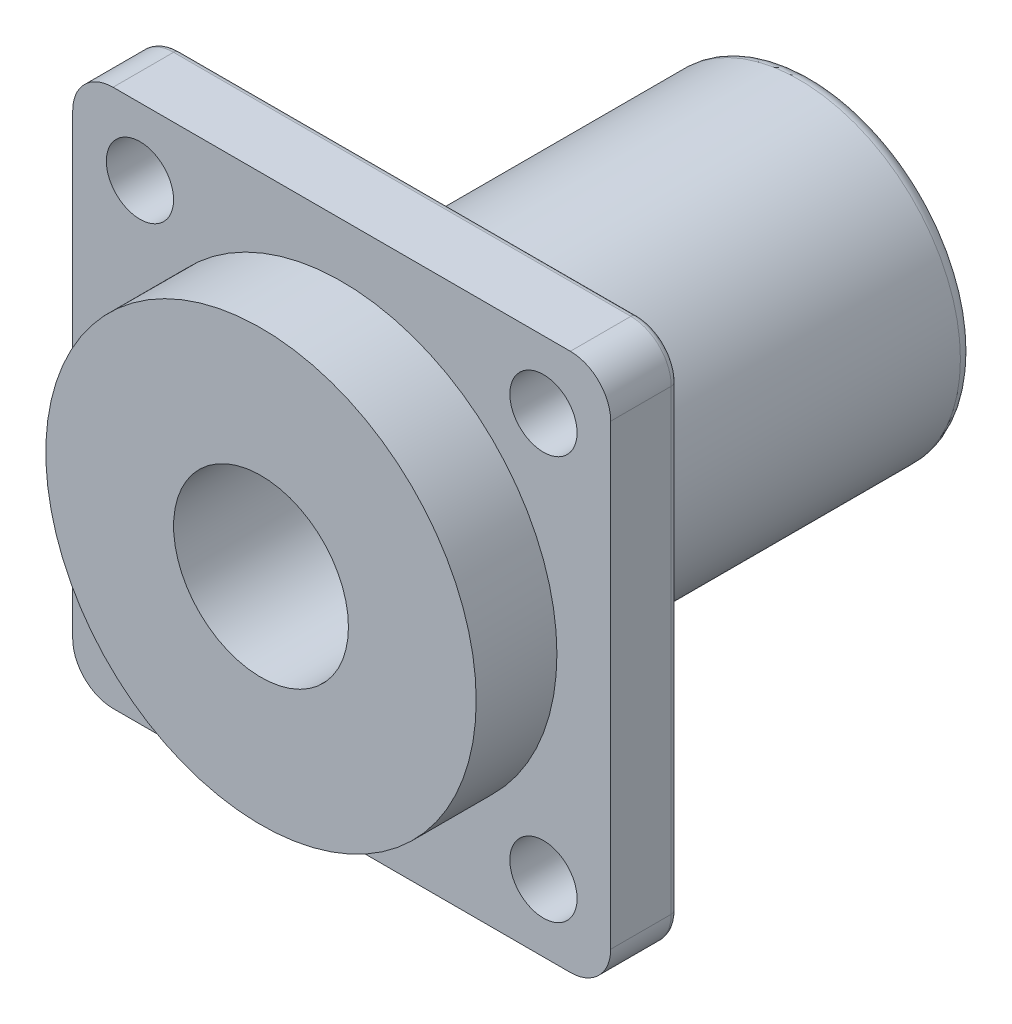
ISO-10303-21;
HEADER;
FILE_DESCRIPTION(('STEP AP214'),'2;1');
FILE_NAME('part.step','',(''),(''),'','','');
FILE_SCHEMA(('AUTOMOTIVE_DESIGN { 1 0 10303 214 1 1 1 1 }'));
ENDSEC;
DATA;
#1=APPLICATION_CONTEXT('core data for automotive mechanical design processes');
#2=APPLICATION_PROTOCOL_DEFINITION('international standard','automotive_design',2000,#1);
#3=PRODUCT_CONTEXT('',#1,'mechanical');
#4=PRODUCT('Part','Part','',(#3));
#5=PRODUCT_RELATED_PRODUCT_CATEGORY('part','',(#4));
#6=PRODUCT_DEFINITION_FORMATION('','',#4);
#7=PRODUCT_DEFINITION_CONTEXT('part definition',#1,'design');
#8=PRODUCT_DEFINITION('design','',#6,#7);
#9=PRODUCT_DEFINITION_SHAPE('','',#8);
#10=(LENGTH_UNIT() NAMED_UNIT(*) SI_UNIT(.MILLI.,.METRE.));
#11=(NAMED_UNIT(*) PLANE_ANGLE_UNIT() SI_UNIT($,.RADIAN.));
#12=(NAMED_UNIT(*) SI_UNIT($,.STERADIAN.) SOLID_ANGLE_UNIT());
#13=UNCERTAINTY_MEASURE_WITH_UNIT(LENGTH_MEASURE(1.E-05),#10,'distance_accuracy_value','');
#14=(GEOMETRIC_REPRESENTATION_CONTEXT(3) GLOBAL_UNCERTAINTY_ASSIGNED_CONTEXT((#13)) GLOBAL_UNIT_ASSIGNED_CONTEXT((#10,
#11,#12)) REPRESENTATION_CONTEXT('',''));
#15=CARTESIAN_POINT('',(0.,0.,0.));
#16=DIRECTION('',(0.,0.,1.));
#17=DIRECTION('',(1.,0.,0.));
#18=AXIS2_PLACEMENT_3D('',#15,#16,#17);
#19=CARTESIAN_POINT('',(0.,0.,2.5));
#20=DIRECTION('',(0.,0.,1.));
#21=DIRECTION('',(1.,0.,0.));
#22=AXIS2_PLACEMENT_3D('',#19,#20,#21);
#23=PLANE('',#22);
#24=DIRECTION('',(0.,-1.,0.));
#25=VECTOR('',#24,1.);
#26=CARTESIAN_POINT('',(20.,0.,2.5));
#27=LINE('',#26,#25);
#28=CARTESIAN_POINT('',(20.,17.,2.5));
#29=VERTEX_POINT('',#28);
#30=CARTESIAN_POINT('',(20.,-17.,2.5));
#31=VERTEX_POINT('',#30);
#32=EDGE_CURVE('E169',#29,#31,#27,.T.);
#33=ORIENTED_EDGE('',*,*,#32,.F.);
#34=CARTESIAN_POINT('',(17.,17.,2.5));
#35=DIRECTION('',(0.,0.,1.));
#36=DIRECTION('',(1.,0.,0.));
#37=AXIS2_PLACEMENT_3D('',#34,#35,#36);
#38=CIRCLE('',#37,3.);
#39=CARTESIAN_POINT('',(17.,20.,2.5));
#40=VERTEX_POINT('',#39);
#41=EDGE_CURVE('E167',#29,#40,#38,.T.);
#42=ORIENTED_EDGE('',*,*,#41,.T.);
#43=DIRECTION('',(1.,0.,0.));
#44=VECTOR('',#43,1.);
#45=CARTESIAN_POINT('',(0.,20.,2.5));
#46=LINE('',#45,#44);
#47=CARTESIAN_POINT('',(-17.,20.,2.5));
#48=VERTEX_POINT('',#47);
#49=EDGE_CURVE('E149',#48,#40,#46,.T.);
#50=ORIENTED_EDGE('',*,*,#49,.F.);
#51=CARTESIAN_POINT('',(-17.,17.,2.5));
#52=DIRECTION('',(0.,0.,1.));
#53=DIRECTION('',(1.,0.,0.));
#54=AXIS2_PLACEMENT_3D('',#51,#52,#53);
#55=CIRCLE('',#54,3.);
#56=CARTESIAN_POINT('',(-20.,17.,2.5));
#57=VERTEX_POINT('',#56);
#58=EDGE_CURVE('E164',#48,#57,#55,.T.);
#59=ORIENTED_EDGE('',*,*,#58,.T.);
#60=DIRECTION('',(0.,-1.,0.));
#61=VECTOR('',#60,1.);
#62=CARTESIAN_POINT('',(-20.,0.,2.5));
#63=LINE('',#62,#61);
#64=CARTESIAN_POINT('',(-20.,-17.,2.5));
#65=VERTEX_POINT('',#64);
#66=EDGE_CURVE('E168',#57,#65,#63,.T.);
#67=ORIENTED_EDGE('',*,*,#66,.T.);
#68=CARTESIAN_POINT('',(-17.,-17.,2.5));
#69=DIRECTION('',(0.,0.,1.));
#70=DIRECTION('',(1.,0.,0.));
#71=AXIS2_PLACEMENT_3D('',#68,#69,#70);
#72=CIRCLE('',#71,3.);
#73=CARTESIAN_POINT('',(-17.,-20.,2.5));
#74=VERTEX_POINT('',#73);
#75=EDGE_CURVE('E174',#65,#74,#72,.T.);
#76=ORIENTED_EDGE('',*,*,#75,.T.);
#77=DIRECTION('',(1.,0.,0.));
#78=VECTOR('',#77,1.);
#79=CARTESIAN_POINT('',(0.,-20.,2.5));
#80=LINE('',#79,#78);
#81=CARTESIAN_POINT('',(17.,-20.,2.5));
#82=VERTEX_POINT('',#81);
#83=EDGE_CURVE('E158',#74,#82,#80,.T.);
#84=ORIENTED_EDGE('',*,*,#83,.T.);
#85=CARTESIAN_POINT('',(17.,-17.,2.5));
#86=DIRECTION('',(0.,0.,1.));
#87=DIRECTION('',(1.,0.,0.));
#88=AXIS2_PLACEMENT_3D('',#85,#86,#87);
#89=CIRCLE('',#88,3.);
#90=EDGE_CURVE('E177',#82,#31,#89,.T.);
#91=ORIENTED_EDGE('',*,*,#90,.T.);
#92=EDGE_LOOP('',(#33,#42,#50,#59,#67,#76,#84,#91));
#93=FACE_BOUND('',#92,.T.);
#94=CARTESIAN_POINT('',(-15.,15.,2.5));
#95=DIRECTION('',(0.,0.,1.));
#96=DIRECTION('',(1.,0.,0.));
#97=AXIS2_PLACEMENT_3D('',#94,#95,#96);
#98=CIRCLE('',#97,2.5);
#99=CARTESIAN_POINT('',(-12.5,15.,2.5));
#100=VERTEX_POINT('',#99);
#101=EDGE_CURVE('E390',#100,#100,#98,.T.);
#102=ORIENTED_EDGE('',*,*,#101,.F.);
#103=EDGE_LOOP('',(#102));
#104=FACE_BOUND('',#103,.T.);
#105=CARTESIAN_POINT('',(15.,15.,2.5));
#106=DIRECTION('',(0.,0.,1.));
#107=DIRECTION('',(1.,0.,0.));
#108=AXIS2_PLACEMENT_3D('',#105,#106,#107);
#109=CIRCLE('',#108,2.5);
#110=CARTESIAN_POINT('',(17.5,15.,2.5));
#111=VERTEX_POINT('',#110);
#112=EDGE_CURVE('E393',#111,#111,#109,.T.);
#113=ORIENTED_EDGE('',*,*,#112,.F.);
#114=EDGE_LOOP('',(#113));
#115=FACE_BOUND('',#114,.T.);
#116=CARTESIAN_POINT('',(15.,-15.,2.5));
#117=DIRECTION('',(0.,0.,1.));
#118=DIRECTION('',(1.,0.,0.));
#119=AXIS2_PLACEMENT_3D('',#116,#117,#118);
#120=CIRCLE('',#119,2.5);
#121=CARTESIAN_POINT('',(17.5,-15.,2.5));
#122=VERTEX_POINT('',#121);
#123=EDGE_CURVE('E396',#122,#122,#120,.T.);
#124=ORIENTED_EDGE('',*,*,#123,.F.);
#125=EDGE_LOOP('',(#124));
#126=FACE_BOUND('',#125,.T.);
#127=CARTESIAN_POINT('',(-15.,-15.,2.5));
#128=DIRECTION('',(0.,0.,1.));
#129=DIRECTION('',(1.,0.,0.));
#130=AXIS2_PLACEMENT_3D('',#127,#128,#129);
#131=CIRCLE('',#130,2.5);
#132=CARTESIAN_POINT('',(-12.5,-15.,2.5));
#133=VERTEX_POINT('',#132);
#134=EDGE_CURVE('E375',#133,#133,#131,.T.);
#135=ORIENTED_EDGE('',*,*,#134,.F.);
#136=EDGE_LOOP('',(#135));
#137=FACE_BOUND('',#136,.T.);
#138=CARTESIAN_POINT('',(0.,0.,2.5));
#139=DIRECTION('',(0.,0.,1.));
#140=DIRECTION('',(1.,0.,0.));
#141=AXIS2_PLACEMENT_3D('',#138,#139,#140);
#142=CIRCLE('',#141,16.);
#143=CARTESIAN_POINT('',(16.,0.,2.5));
#144=VERTEX_POINT('',#143);
#145=EDGE_CURVE('E401',#144,#144,#142,.T.);
#146=ORIENTED_EDGE('',*,*,#145,.F.);
#147=EDGE_LOOP('',(#146));
#148=FACE_BOUND('',#147,.T.);
#149=ADVANCED_FACE('F54',(#93,#104,#115,#126,#137,#148),#23,.T.);
#150=CARTESIAN_POINT('',(20.,0.,2.5));
#151=DIRECTION('',(1.,0.,0.));
#152=DIRECTION('',(0.,0.,-1.));
#153=AXIS2_PLACEMENT_3D('',#150,#151,#152);
#154=PLANE('',#153);
#155=DIRECTION('',(0.,0.,-1.));
#156=VECTOR('',#155,1.);
#157=CARTESIAN_POINT('',(20.,-17.,-2.5));
#158=LINE('',#157,#156);
#159=CARTESIAN_POINT('',(20.,-17.,-2.));
#160=VERTEX_POINT('',#159);
#161=EDGE_CURVE('E179',#31,#160,#158,.T.);
#162=ORIENTED_EDGE('',*,*,#161,.T.);
#163=DIRECTION('',(0.,-1.,0.));
#164=VECTOR('',#163,1.);
#165=CARTESIAN_POINT('',(20.,17.,-2.));
#166=LINE('',#165,#164);
#167=CARTESIAN_POINT('',(20.,17.,-2.));
#168=VERTEX_POINT('',#167);
#169=EDGE_CURVE('E214',#160,#168,#166,.F.);
#170=ORIENTED_EDGE('',*,*,#169,.T.);
#171=DIRECTION('',(0.,0.,-1.));
#172=VECTOR('',#171,1.);
#173=CARTESIAN_POINT('',(20.,17.,2.5));
#174=LINE('',#173,#172);
#175=EDGE_CURVE('E175',#168,#29,#174,.F.);
#176=ORIENTED_EDGE('',*,*,#175,.T.);
#177=ORIENTED_EDGE('',*,*,#32,.T.);
#178=EDGE_LOOP('',(#162,#170,#176,#177));
#179=FACE_BOUND('',#178,.T.);
#180=ADVANCED_FACE('F266',(#179),#154,.T.);
#181=CARTESIAN_POINT('',(0.,20.,2.5));
#182=DIRECTION('',(0.,1.,0.));
#183=DIRECTION('',(0.,0.,1.));
#184=AXIS2_PLACEMENT_3D('',#181,#182,#183);
#185=PLANE('',#184);
#186=DIRECTION('',(0.,0.,-1.));
#187=VECTOR('',#186,1.);
#188=CARTESIAN_POINT('',(17.,20.,2.5));
#189=LINE('',#188,#187);
#190=CARTESIAN_POINT('',(17.,20.,-2.));
#191=VERTEX_POINT('',#190);
#192=EDGE_CURVE('E157',#40,#191,#189,.T.);
#193=ORIENTED_EDGE('',*,*,#192,.T.);
#194=DIRECTION('',(1.,0.,0.));
#195=VECTOR('',#194,1.);
#196=CARTESIAN_POINT('',(-17.,20.,-2.));
#197=LINE('',#196,#195);
#198=CARTESIAN_POINT('',(-17.,20.,-2.));
#199=VERTEX_POINT('',#198);
#200=EDGE_CURVE('E152',#191,#199,#197,.F.);
#201=ORIENTED_EDGE('',*,*,#200,.T.);
#202=DIRECTION('',(0.,0.,-1.));
#203=VECTOR('',#202,1.);
#204=CARTESIAN_POINT('',(-17.,20.,2.5));
#205=LINE('',#204,#203);
#206=EDGE_CURVE('E145',#199,#48,#205,.F.);
#207=ORIENTED_EDGE('',*,*,#206,.T.);
#208=ORIENTED_EDGE('',*,*,#49,.T.);
#209=EDGE_LOOP('',(#193,#201,#207,#208));
#210=FACE_BOUND('',#209,.T.);
#211=ADVANCED_FACE('F148',(#210),#185,.T.);
#212=CARTESIAN_POINT('',(-20.,0.,2.5));
#213=DIRECTION('',(1.,0.,0.));
#214=DIRECTION('',(0.,0.,-1.));
#215=AXIS2_PLACEMENT_3D('',#212,#213,#214);
#216=PLANE('',#215);
#217=DIRECTION('',(0.,0.,-1.));
#218=VECTOR('',#217,1.);
#219=CARTESIAN_POINT('',(-20.,17.,-2.5));
#220=LINE('',#219,#218);
#221=CARTESIAN_POINT('',(-20.,17.,-2.));
#222=VERTEX_POINT('',#221);
#223=EDGE_CURVE('E173',#57,#222,#220,.T.);
#224=ORIENTED_EDGE('',*,*,#223,.T.);
#225=DIRECTION('',(0.,-1.,0.));
#226=VECTOR('',#225,1.);
#227=CARTESIAN_POINT('',(-20.,0.,-2.));
#228=LINE('',#227,#226);
#229=CARTESIAN_POINT('',(-20.,-17.,-2.));
#230=VERTEX_POINT('',#229);
#231=EDGE_CURVE('E69',#222,#230,#228,.T.);
#232=ORIENTED_EDGE('',*,*,#231,.T.);
#233=DIRECTION('',(0.,0.,-1.));
#234=VECTOR('',#233,1.);
#235=CARTESIAN_POINT('',(-20.,-17.,2.5));
#236=LINE('',#235,#234);
#237=EDGE_CURVE('E190',#230,#65,#236,.F.);
#238=ORIENTED_EDGE('',*,*,#237,.T.);
#239=ORIENTED_EDGE('',*,*,#66,.F.);
#240=EDGE_LOOP('',(#224,#232,#238,#239));
#241=FACE_BOUND('',#240,.T.);
#242=ADVANCED_FACE('F291',(#241),#216,.F.);
#243=CARTESIAN_POINT('',(0.,-20.,2.5));
#244=DIRECTION('',(0.,1.,0.));
#245=DIRECTION('',(0.,0.,1.));
#246=AXIS2_PLACEMENT_3D('',#243,#244,#245);
#247=PLANE('',#246);
#248=DIRECTION('',(0.,0.,-1.));
#249=VECTOR('',#248,1.);
#250=CARTESIAN_POINT('',(-17.,-20.,2.5));
#251=LINE('',#250,#249);
#252=CARTESIAN_POINT('',(-17.,-20.,-2.));
#253=VERTEX_POINT('',#252);
#254=EDGE_CURVE('E185',#74,#253,#251,.T.);
#255=ORIENTED_EDGE('',*,*,#254,.T.);
#256=DIRECTION('',(1.,0.,0.));
#257=VECTOR('',#256,1.);
#258=CARTESIAN_POINT('',(0.,-20.,-2.));
#259=LINE('',#258,#257);
#260=CARTESIAN_POINT('',(17.,-20.,-2.));
#261=VERTEX_POINT('',#260);
#262=EDGE_CURVE('E218',#253,#261,#259,.T.);
#263=ORIENTED_EDGE('',*,*,#262,.T.);
#264=DIRECTION('',(0.,0.,-1.));
#265=VECTOR('',#264,1.);
#266=CARTESIAN_POINT('',(17.,-20.,2.5));
#267=LINE('',#266,#265);
#268=EDGE_CURVE('E187',#261,#82,#267,.F.);
#269=ORIENTED_EDGE('',*,*,#268,.T.);
#270=ORIENTED_EDGE('',*,*,#83,.F.);
#271=EDGE_LOOP('',(#255,#263,#269,#270));
#272=FACE_BOUND('',#271,.T.);
#273=ADVANCED_FACE('F287',(#272),#247,.F.);
#274=CARTESIAN_POINT('',(-15.,15.,2.5));
#275=DIRECTION('',(0.,0.,-1.));
#276=DIRECTION('',(-1.,0.,0.));
#277=AXIS2_PLACEMENT_3D('',#274,#275,#276);
#278=CYLINDRICAL_SURFACE('',#277,2.5);
#279=ORIENTED_EDGE('',*,*,#101,.T.);
#280=EDGE_LOOP('',(#279));
#281=FACE_BOUND('',#280,.T.);
#282=CARTESIAN_POINT('',(-15.,15.,-2.5));
#283=DIRECTION('',(0.,0.,1.));
#284=DIRECTION('',(1.,0.,0.));
#285=AXIS2_PLACEMENT_3D('',#282,#283,#284);
#286=CIRCLE('',#285,2.5);
#287=CARTESIAN_POINT('',(-12.5,15.,-2.5));
#288=VERTEX_POINT('',#287);
#289=EDGE_CURVE('E372',#288,#288,#286,.T.);
#290=ORIENTED_EDGE('',*,*,#289,.F.);
#291=EDGE_LOOP('',(#290));
#292=FACE_BOUND('',#291,.T.);
#293=ADVANCED_FACE('F290',(#281,#292),#278,.F.);
#294=CARTESIAN_POINT('',(15.,15.,2.5));
#295=DIRECTION('',(0.,0.,-1.));
#296=DIRECTION('',(-1.,0.,0.));
#297=AXIS2_PLACEMENT_3D('',#294,#295,#296);
#298=CYLINDRICAL_SURFACE('',#297,2.5);
#299=ORIENTED_EDGE('',*,*,#112,.T.);
#300=EDGE_LOOP('',(#299));
#301=FACE_BOUND('',#300,.T.);
#302=CARTESIAN_POINT('',(15.,15.,-2.5));
#303=DIRECTION('',(0.,0.,1.));
#304=DIRECTION('',(1.,0.,0.));
#305=AXIS2_PLACEMENT_3D('',#302,#303,#304);
#306=CIRCLE('',#305,2.5);
#307=CARTESIAN_POINT('',(17.5,15.,-2.5));
#308=VERTEX_POINT('',#307);
#309=EDGE_CURVE('E376',#308,#308,#306,.T.);
#310=ORIENTED_EDGE('',*,*,#309,.F.);
#311=EDGE_LOOP('',(#310));
#312=FACE_BOUND('',#311,.T.);
#313=ADVANCED_FACE('F299',(#301,#312),#298,.F.);
#314=CARTESIAN_POINT('',(15.,-15.,2.5));
#315=DIRECTION('',(0.,0.,-1.));
#316=DIRECTION('',(-1.,0.,0.));
#317=AXIS2_PLACEMENT_3D('',#314,#315,#316);
#318=CYLINDRICAL_SURFACE('',#317,2.5);
#319=ORIENTED_EDGE('',*,*,#123,.T.);
#320=EDGE_LOOP('',(#319));
#321=FACE_BOUND('',#320,.T.);
#322=CARTESIAN_POINT('',(15.,-15.,-2.5));
#323=DIRECTION('',(0.,0.,1.));
#324=DIRECTION('',(1.,0.,0.));
#325=AXIS2_PLACEMENT_3D('',#322,#323,#324);
#326=CIRCLE('',#325,2.5);
#327=CARTESIAN_POINT('',(17.5,-15.,-2.5));
#328=VERTEX_POINT('',#327);
#329=EDGE_CURVE('E379',#328,#328,#326,.T.);
#330=ORIENTED_EDGE('',*,*,#329,.F.);
#331=EDGE_LOOP('',(#330));
#332=FACE_BOUND('',#331,.T.);
#333=ADVANCED_FACE('F303',(#321,#332),#318,.F.);
#334=CARTESIAN_POINT('',(-15.,-15.,2.5));
#335=DIRECTION('',(0.,0.,-1.));
#336=DIRECTION('',(-1.,0.,0.));
#337=AXIS2_PLACEMENT_3D('',#334,#335,#336);
#338=CYLINDRICAL_SURFACE('',#337,2.5);
#339=ORIENTED_EDGE('',*,*,#134,.T.);
#340=EDGE_LOOP('',(#339));
#341=FACE_BOUND('',#340,.T.);
#342=CARTESIAN_POINT('',(-15.,-15.,-2.5));
#343=DIRECTION('',(0.,0.,1.));
#344=DIRECTION('',(1.,0.,0.));
#345=AXIS2_PLACEMENT_3D('',#342,#343,#344);
#346=CIRCLE('',#345,2.5);
#347=CARTESIAN_POINT('',(-12.5,-15.,-2.5));
#348=VERTEX_POINT('',#347);
#349=EDGE_CURVE('E382',#348,#348,#346,.T.);
#350=ORIENTED_EDGE('',*,*,#349,.F.);
#351=EDGE_LOOP('',(#350));
#352=FACE_BOUND('',#351,.T.);
#353=ADVANCED_FACE('F285',(#341,#352),#338,.F.);
#354=CARTESIAN_POINT('',(0.,0.,2.5));
#355=DIRECTION('',(0.,0.,-1.));
#356=DIRECTION('',(-1.,0.,0.));
#357=AXIS2_PLACEMENT_3D('',#354,#355,#356);
#358=CYLINDRICAL_SURFACE('',#357,6.5);
#359=CARTESIAN_POINT('',(0.,0.,8.5));
#360=DIRECTION('',(0.,0.,1.));
#361=DIRECTION('',(1.,0.,0.));
#362=AXIS2_PLACEMENT_3D('',#359,#360,#361);
#363=CIRCLE('',#362,6.5);
#364=CARTESIAN_POINT('',(6.5,0.,8.5));
#365=VERTEX_POINT('',#364);
#366=EDGE_CURVE('E404',#365,#365,#363,.T.);
#367=ORIENTED_EDGE('',*,*,#366,.T.);
#368=EDGE_LOOP('',(#367));
#369=FACE_BOUND('',#368,.T.);
#370=CARTESIAN_POINT('',(0.,0.,-32.5));
#371=DIRECTION('',(0.,0.,1.));
#372=DIRECTION('',(1.,0.,0.));
#373=AXIS2_PLACEMENT_3D('',#370,#371,#372);
#374=CIRCLE('',#373,6.5);
#375=CARTESIAN_POINT('',(6.5,0.,-32.5));
#376=VERTEX_POINT('',#375);
#377=EDGE_CURVE('E245',#376,#376,#374,.T.);
#378=ORIENTED_EDGE('',*,*,#377,.F.);
#379=EDGE_LOOP('',(#378));
#380=FACE_BOUND('',#379,.T.);
#381=ADVANCED_FACE('F281',(#369,#380),#358,.F.);
#382=CARTESIAN_POINT('',(0.,0.,-2.5));
#383=DIRECTION('',(0.,0.,1.));
#384=DIRECTION('',(1.,0.,0.));
#385=AXIS2_PLACEMENT_3D('',#382,#383,#384);
#386=PLANE('',#385);
#387=CARTESIAN_POINT('',(0.,0.,-2.5));
#388=DIRECTION('',(0.,0.,1.));
#389=DIRECTION('',(1.,0.,0.));
#390=AXIS2_PLACEMENT_3D('',#387,#388,#389);
#391=CIRCLE('',#390,17.);
#392=CARTESIAN_POINT('',(17.,0.,-2.5));
#393=VERTEX_POINT('',#392);
#394=EDGE_CURVE('E222',#393,#393,#391,.T.);
#395=ORIENTED_EDGE('',*,*,#394,.T.);
#396=EDGE_LOOP('',(#395));
#397=FACE_BOUND('',#396,.T.);
#398=DIRECTION('',(0.,-1.,0.));
#399=VECTOR('',#398,1.);
#400=CARTESIAN_POINT('',(-19.5,0.,-2.5));
#401=LINE('',#400,#399);
#402=CARTESIAN_POINT('',(-19.5,-17.,-2.5));
#403=VERTEX_POINT('',#402);
#404=CARTESIAN_POINT('',(-19.5,17.,-2.5));
#405=VERTEX_POINT('',#404);
#406=EDGE_CURVE('E192',#403,#405,#401,.F.);
#407=ORIENTED_EDGE('',*,*,#406,.T.);
#408=CARTESIAN_POINT('',(-17.,17.,-2.5));
#409=DIRECTION('',(0.,0.,1.));
#410=DIRECTION('',(1.,0.,0.));
#411=AXIS2_PLACEMENT_3D('',#408,#409,#410);
#412=CIRCLE('',#411,2.5);
#413=CARTESIAN_POINT('',(-17.,19.5,-2.5));
#414=VERTEX_POINT('',#413);
#415=EDGE_CURVE('E206',#405,#414,#412,.F.);
#416=ORIENTED_EDGE('',*,*,#415,.T.);
#417=DIRECTION('',(1.,0.,0.));
#418=VECTOR('',#417,1.);
#419=CARTESIAN_POINT('',(17.,19.5,-2.5));
#420=LINE('',#419,#418);
#421=CARTESIAN_POINT('',(17.,19.5,-2.5));
#422=VERTEX_POINT('',#421);
#423=EDGE_CURVE('E204',#414,#422,#420,.T.);
#424=ORIENTED_EDGE('',*,*,#423,.T.);
#425=CARTESIAN_POINT('',(17.,17.,-2.5));
#426=DIRECTION('',(0.,0.,1.));
#427=DIRECTION('',(1.,0.,0.));
#428=AXIS2_PLACEMENT_3D('',#425,#426,#427);
#429=CIRCLE('',#428,2.5);
#430=CARTESIAN_POINT('',(19.5,17.,-2.5));
#431=VERTEX_POINT('',#430);
#432=EDGE_CURVE('E202',#422,#431,#429,.F.);
#433=ORIENTED_EDGE('',*,*,#432,.T.);
#434=DIRECTION('',(0.,-1.,0.));
#435=VECTOR('',#434,1.);
#436=CARTESIAN_POINT('',(19.5,-17.,-2.5));
#437=LINE('',#436,#435);
#438=CARTESIAN_POINT('',(19.5,-17.,-2.5));
#439=VERTEX_POINT('',#438);
#440=EDGE_CURVE('E200',#431,#439,#437,.T.);
#441=ORIENTED_EDGE('',*,*,#440,.T.);
#442=CARTESIAN_POINT('',(17.,-17.,-2.5));
#443=DIRECTION('',(0.,0.,1.));
#444=DIRECTION('',(1.,0.,0.));
#445=AXIS2_PLACEMENT_3D('',#442,#443,#444);
#446=CIRCLE('',#445,2.5);
#447=CARTESIAN_POINT('',(17.,-19.5,-2.5));
#448=VERTEX_POINT('',#447);
#449=EDGE_CURVE('E198',#439,#448,#446,.F.);
#450=ORIENTED_EDGE('',*,*,#449,.T.);
#451=DIRECTION('',(1.,0.,0.));
#452=VECTOR('',#451,1.);
#453=CARTESIAN_POINT('',(0.,-19.5,-2.5));
#454=LINE('',#453,#452);
#455=CARTESIAN_POINT('',(-17.,-19.5,-2.5));
#456=VERTEX_POINT('',#455);
#457=EDGE_CURVE('E196',#448,#456,#454,.F.);
#458=ORIENTED_EDGE('',*,*,#457,.T.);
#459=CARTESIAN_POINT('',(-17.,-17.,-2.5));
#460=DIRECTION('',(0.,0.,1.));
#461=DIRECTION('',(1.,0.,0.));
#462=AXIS2_PLACEMENT_3D('',#459,#460,#461);
#463=CIRCLE('',#462,2.5);
#464=EDGE_CURVE('E194',#456,#403,#463,.F.);
#465=ORIENTED_EDGE('',*,*,#464,.T.);
#466=EDGE_LOOP('',(#407,#416,#424,#433,#441,#450,#458,#465));
#467=FACE_BOUND('',#466,.T.);
#468=ORIENTED_EDGE('',*,*,#349,.T.);
#469=EDGE_LOOP('',(#468));
#470=FACE_BOUND('',#469,.T.);
#471=ORIENTED_EDGE('',*,*,#329,.T.);
#472=EDGE_LOOP('',(#471));
#473=FACE_BOUND('',#472,.T.);
#474=ORIENTED_EDGE('',*,*,#309,.T.);
#475=EDGE_LOOP('',(#474));
#476=FACE_BOUND('',#475,.T.);
#477=ORIENTED_EDGE('',*,*,#289,.T.);
#478=EDGE_LOOP('',(#477));
#479=FACE_BOUND('',#478,.T.);
#480=ADVANCED_FACE('F277',(#397,#467,#470,#473,#476,#479),#386,.F.);
#481=CARTESIAN_POINT('',(0.,0.,8.5));
#482=DIRECTION('',(0.,0.,1.));
#483=DIRECTION('',(1.,0.,0.));
#484=AXIS2_PLACEMENT_3D('',#481,#482,#483);
#485=PLANE('',#484);
#486=CARTESIAN_POINT('',(0.,0.,8.5));
#487=DIRECTION('',(0.,0.,1.));
#488=DIRECTION('',(1.,0.,0.));
#489=AXIS2_PLACEMENT_3D('',#486,#487,#488);
#490=CIRCLE('',#489,16.);
#491=CARTESIAN_POINT('',(16.,0.,8.5));
#492=VERTEX_POINT('',#491);
#493=EDGE_CURVE('E385',#492,#492,#490,.T.);
#494=ORIENTED_EDGE('',*,*,#493,.T.);
#495=EDGE_LOOP('',(#494));
#496=FACE_BOUND('',#495,.T.);
#497=ORIENTED_EDGE('',*,*,#366,.F.);
#498=EDGE_LOOP('',(#497));
#499=FACE_BOUND('',#498,.T.);
#500=ADVANCED_FACE('F280',(#496,#499),#485,.T.);
#501=CARTESIAN_POINT('',(0.,0.,8.5));
#502=DIRECTION('',(0.,0.,-1.));
#503=DIRECTION('',(-1.,0.,0.));
#504=AXIS2_PLACEMENT_3D('',#501,#502,#503);
#505=CYLINDRICAL_SURFACE('',#504,16.);
#506=ORIENTED_EDGE('',*,*,#493,.F.);
#507=EDGE_LOOP('',(#506));
#508=FACE_BOUND('',#507,.T.);
#509=ORIENTED_EDGE('',*,*,#145,.T.);
#510=EDGE_LOOP('',(#509));
#511=FACE_BOUND('',#510,.T.);
#512=ADVANCED_FACE('F275',(#508,#511),#505,.T.);
#513=CARTESIAN_POINT('',(0.,0.,-32.5));
#514=DIRECTION('',(0.,0.,1.));
#515=DIRECTION('',(1.,0.,0.));
#516=AXIS2_PLACEMENT_3D('',#513,#514,#515);
#517=CYLINDRICAL_SURFACE('',#516,12.);
#518=CARTESIAN_POINT('',(0.,0.,-31.5));
#519=DIRECTION('',(0.,0.,1.));
#520=DIRECTION('',(1.,0.,0.));
#521=AXIS2_PLACEMENT_3D('',#518,#519,#520);
#522=CIRCLE('',#521,12.);
#523=CARTESIAN_POINT('',(12.,0.,-31.5));
#524=VERTEX_POINT('',#523);
#525=EDGE_CURVE('E62',#524,#524,#522,.T.);
#526=ORIENTED_EDGE('',*,*,#525,.T.);
#527=EDGE_LOOP('',(#526));
#528=FACE_BOUND('',#527,.T.);
#529=CARTESIAN_POINT('',(0.,0.,-7.5));
#530=DIRECTION('',(0.,0.,1.));
#531=DIRECTION('',(1.,0.,0.));
#532=AXIS2_PLACEMENT_3D('',#529,#530,#531);
#533=CIRCLE('',#532,12.);
#534=CARTESIAN_POINT('',(12.,0.,-7.5));
#535=VERTEX_POINT('',#534);
#536=EDGE_CURVE('E248',#535,#535,#533,.F.);
#537=ORIENTED_EDGE('',*,*,#536,.T.);
#538=EDGE_LOOP('',(#537));
#539=FACE_BOUND('',#538,.T.);
#540=ADVANCED_FACE('F253',(#528,#539),#517,.T.);
#541=CARTESIAN_POINT('',(0.,0.,-32.5));
#542=DIRECTION('',(0.,0.,1.));
#543=DIRECTION('',(1.,0.,0.));
#544=AXIS2_PLACEMENT_3D('',#541,#542,#543);
#545=PLANE('',#544);
#546=CARTESIAN_POINT('',(0.,0.,-32.5));
#547=DIRECTION('',(0.,0.,1.));
#548=DIRECTION('',(1.,0.,0.));
#549=AXIS2_PLACEMENT_3D('',#546,#547,#548);
#550=CIRCLE('',#549,11.);
#551=CARTESIAN_POINT('',(11.,0.,-32.5));
#552=VERTEX_POINT('',#551);
#553=EDGE_CURVE('E12',#552,#552,#550,.F.);
#554=ORIENTED_EDGE('',*,*,#553,.T.);
#555=EDGE_LOOP('',(#554));
#556=FACE_BOUND('',#555,.T.);
#557=ORIENTED_EDGE('',*,*,#377,.T.);
#558=EDGE_LOOP('',(#557));
#559=FACE_BOUND('',#558,.T.);
#560=ADVANCED_FACE('F315',(#556,#559),#545,.F.);
#561=CARTESIAN_POINT('',(17.,17.,2.5));
#562=DIRECTION('',(0.,0.,-1.));
#563=DIRECTION('',(-1.,0.,0.));
#564=AXIS2_PLACEMENT_3D('',#561,#562,#563);
#565=CYLINDRICAL_SURFACE('',#564,3.);
#566=ORIENTED_EDGE('',*,*,#175,.F.);
#567=CARTESIAN_POINT('',(17.,17.,-2.));
#568=DIRECTION('',(0.,0.,1.));
#569=DIRECTION('',(1.,0.,0.));
#570=AXIS2_PLACEMENT_3D('',#567,#568,#569);
#571=CIRCLE('',#570,3.);
#572=EDGE_CURVE('E212',#168,#191,#571,.T.);
#573=ORIENTED_EDGE('',*,*,#572,.T.);
#574=ORIENTED_EDGE('',*,*,#192,.F.);
#575=ORIENTED_EDGE('',*,*,#41,.F.);
#576=EDGE_LOOP('',(#566,#573,#574,#575));
#577=FACE_BOUND('',#576,.T.);
#578=ADVANCED_FACE('F311',(#577),#565,.T.);
#579=CARTESIAN_POINT('',(17.,-17.,2.5));
#580=DIRECTION('',(0.,0.,1.));
#581=DIRECTION('',(1.,0.,0.));
#582=AXIS2_PLACEMENT_3D('',#579,#580,#581);
#583=CYLINDRICAL_SURFACE('',#582,3.);
#584=ORIENTED_EDGE('',*,*,#268,.F.);
#585=CARTESIAN_POINT('',(17.,-17.,-2.));
#586=DIRECTION('',(0.,0.,1.));
#587=DIRECTION('',(1.,0.,0.));
#588=AXIS2_PLACEMENT_3D('',#585,#586,#587);
#589=CIRCLE('',#588,3.);
#590=EDGE_CURVE('E216',#261,#160,#589,.T.);
#591=ORIENTED_EDGE('',*,*,#590,.T.);
#592=ORIENTED_EDGE('',*,*,#161,.F.);
#593=ORIENTED_EDGE('',*,*,#90,.F.);
#594=EDGE_LOOP('',(#584,#591,#592,#593));
#595=FACE_BOUND('',#594,.T.);
#596=ADVANCED_FACE('F314',(#595),#583,.T.);
#597=CARTESIAN_POINT('',(-17.,-17.,2.5));
#598=DIRECTION('',(0.,0.,-1.));
#599=DIRECTION('',(-1.,0.,0.));
#600=AXIS2_PLACEMENT_3D('',#597,#598,#599);
#601=CYLINDRICAL_SURFACE('',#600,3.);
#602=ORIENTED_EDGE('',*,*,#237,.F.);
#603=CARTESIAN_POINT('',(-17.,-17.,-2.));
#604=DIRECTION('',(0.,0.,1.));
#605=DIRECTION('',(1.,0.,0.));
#606=AXIS2_PLACEMENT_3D('',#603,#604,#605);
#607=CIRCLE('',#606,3.);
#608=EDGE_CURVE('E76',#230,#253,#607,.T.);
#609=ORIENTED_EDGE('',*,*,#608,.T.);
#610=ORIENTED_EDGE('',*,*,#254,.F.);
#611=ORIENTED_EDGE('',*,*,#75,.F.);
#612=EDGE_LOOP('',(#602,#609,#610,#611));
#613=FACE_BOUND('',#612,.T.);
#614=ADVANCED_FACE('F319',(#613),#601,.T.);
#615=CARTESIAN_POINT('',(-17.,17.,2.5));
#616=DIRECTION('',(0.,0.,1.));
#617=DIRECTION('',(1.,0.,0.));
#618=AXIS2_PLACEMENT_3D('',#615,#616,#617);
#619=CYLINDRICAL_SURFACE('',#618,3.);
#620=ORIENTED_EDGE('',*,*,#206,.F.);
#621=CARTESIAN_POINT('',(-17.,17.,-2.));
#622=DIRECTION('',(0.,0.,1.));
#623=DIRECTION('',(1.,0.,0.));
#624=AXIS2_PLACEMENT_3D('',#621,#622,#623);
#625=CIRCLE('',#624,3.);
#626=EDGE_CURVE('E209',#199,#222,#625,.T.);
#627=ORIENTED_EDGE('',*,*,#626,.T.);
#628=ORIENTED_EDGE('',*,*,#223,.F.);
#629=ORIENTED_EDGE('',*,*,#58,.F.);
#630=EDGE_LOOP('',(#620,#627,#628,#629));
#631=FACE_BOUND('',#630,.T.);
#632=ADVANCED_FACE('F172',(#631),#619,.T.);
#633=CARTESIAN_POINT('',(17.,-17.,-2.));
#634=DIRECTION('',(0.,0.,1.));
#635=DIRECTION('',(1.,0.,0.));
#636=AXIS2_PLACEMENT_3D('',#633,#634,#635);
#637=TOROIDAL_SURFACE('',#636,2.5,0.5);
#638=CARTESIAN_POINT('',(19.5,-17.,-2.));
#639=DIRECTION('',(0.,1.,0.));
#640=DIRECTION('',(0.,0.,1.));
#641=AXIS2_PLACEMENT_3D('',#638,#639,#640);
#642=CIRCLE('',#641,0.5);
#643=EDGE_CURVE('E239',#160,#439,#642,.T.);
#644=ORIENTED_EDGE('',*,*,#643,.F.);
#645=ORIENTED_EDGE('',*,*,#590,.F.);
#646=CARTESIAN_POINT('',(17.,-19.5,-2.));
#647=DIRECTION('',(-1.,0.,0.));
#648=DIRECTION('',(0.,0.,1.));
#649=AXIS2_PLACEMENT_3D('',#646,#647,#648);
#650=CIRCLE('',#649,0.5);
#651=EDGE_CURVE('E242',#448,#261,#650,.T.);
#652=ORIENTED_EDGE('',*,*,#651,.F.);
#653=ORIENTED_EDGE('',*,*,#449,.F.);
#654=EDGE_LOOP('',(#644,#645,#652,#653));
#655=FACE_BOUND('',#654,.T.);
#656=ADVANCED_FACE('F325',(#655),#637,.T.);
#657=CARTESIAN_POINT('',(0.,-19.5,-2.));
#658=DIRECTION('',(1.,0.,0.));
#659=DIRECTION('',(0.,0.,-1.));
#660=AXIS2_PLACEMENT_3D('',#657,#658,#659);
#661=CYLINDRICAL_SURFACE('',#660,0.5);
#662=ORIENTED_EDGE('',*,*,#651,.T.);
#663=ORIENTED_EDGE('',*,*,#262,.F.);
#664=CARTESIAN_POINT('',(-17.,-19.5,-2.));
#665=DIRECTION('',(-1.,0.,0.));
#666=DIRECTION('',(0.,0.,1.));
#667=AXIS2_PLACEMENT_3D('',#664,#665,#666);
#668=CIRCLE('',#667,0.5);
#669=EDGE_CURVE('E236',#456,#253,#668,.T.);
#670=ORIENTED_EDGE('',*,*,#669,.F.);
#671=ORIENTED_EDGE('',*,*,#457,.F.);
#672=EDGE_LOOP('',(#662,#663,#670,#671));
#673=FACE_BOUND('',#672,.T.);
#674=ADVANCED_FACE('F348',(#673),#661,.T.);
#675=CARTESIAN_POINT('',(19.5,0.,-2.));
#676=DIRECTION('',(0.,1.,0.));
#677=DIRECTION('',(0.,0.,1.));
#678=AXIS2_PLACEMENT_3D('',#675,#676,#677);
#679=CYLINDRICAL_SURFACE('',#678,0.5);
#680=ORIENTED_EDGE('',*,*,#643,.T.);
#681=ORIENTED_EDGE('',*,*,#440,.F.);
#682=CARTESIAN_POINT('',(19.5,17.,-2.));
#683=DIRECTION('',(0.,1.,0.));
#684=DIRECTION('',(0.,0.,1.));
#685=AXIS2_PLACEMENT_3D('',#682,#683,#684);
#686=CIRCLE('',#685,0.5);
#687=EDGE_CURVE('E233',#168,#431,#686,.T.);
#688=ORIENTED_EDGE('',*,*,#687,.F.);
#689=ORIENTED_EDGE('',*,*,#169,.F.);
#690=EDGE_LOOP('',(#680,#681,#688,#689));
#691=FACE_BOUND('',#690,.T.);
#692=ADVANCED_FACE('F344',(#691),#679,.T.);
#693=CARTESIAN_POINT('',(-17.,-17.,-2.));
#694=DIRECTION('',(0.,0.,1.));
#695=DIRECTION('',(1.,0.,0.));
#696=AXIS2_PLACEMENT_3D('',#693,#694,#695);
#697=TOROIDAL_SURFACE('',#696,2.5,0.5);
#698=ORIENTED_EDGE('',*,*,#669,.T.);
#699=ORIENTED_EDGE('',*,*,#608,.F.);
#700=CARTESIAN_POINT('',(-19.5,-17.,-2.));
#701=DIRECTION('',(0.,1.,0.));
#702=DIRECTION('',(0.,0.,1.));
#703=AXIS2_PLACEMENT_3D('',#700,#701,#702);
#704=CIRCLE('',#703,0.5);
#705=EDGE_CURVE('E230',#403,#230,#704,.T.);
#706=ORIENTED_EDGE('',*,*,#705,.F.);
#707=ORIENTED_EDGE('',*,*,#464,.F.);
#708=EDGE_LOOP('',(#698,#699,#706,#707));
#709=FACE_BOUND('',#708,.T.);
#710=ADVANCED_FACE('F340',(#709),#697,.T.);
#711=CARTESIAN_POINT('',(17.,17.,-2.));
#712=DIRECTION('',(0.,0.,1.));
#713=DIRECTION('',(1.,0.,0.));
#714=AXIS2_PLACEMENT_3D('',#711,#712,#713);
#715=TOROIDAL_SURFACE('',#714,2.5,0.5);
#716=ORIENTED_EDGE('',*,*,#687,.T.);
#717=ORIENTED_EDGE('',*,*,#432,.F.);
#718=CARTESIAN_POINT('',(17.,19.5,-2.));
#719=DIRECTION('',(-1.,0.,0.));
#720=DIRECTION('',(0.,0.,1.));
#721=AXIS2_PLACEMENT_3D('',#718,#719,#720);
#722=CIRCLE('',#721,0.5);
#723=EDGE_CURVE('E227',#191,#422,#722,.T.);
#724=ORIENTED_EDGE('',*,*,#723,.F.);
#725=ORIENTED_EDGE('',*,*,#572,.F.);
#726=EDGE_LOOP('',(#716,#717,#724,#725));
#727=FACE_BOUND('',#726,.T.);
#728=ADVANCED_FACE('F336',(#727),#715,.T.);
#729=CARTESIAN_POINT('',(-19.5,0.,-2.));
#730=DIRECTION('',(0.,-1.,0.));
#731=DIRECTION('',(0.,0.,-1.));
#732=AXIS2_PLACEMENT_3D('',#729,#730,#731);
#733=CYLINDRICAL_SURFACE('',#732,0.5);
#734=ORIENTED_EDGE('',*,*,#705,.T.);
#735=ORIENTED_EDGE('',*,*,#231,.F.);
#736=CARTESIAN_POINT('',(-19.5,17.,-2.));
#737=DIRECTION('',(0.,1.,0.));
#738=DIRECTION('',(0.,0.,1.));
#739=AXIS2_PLACEMENT_3D('',#736,#737,#738);
#740=CIRCLE('',#739,0.5);
#741=EDGE_CURVE('E225',#405,#222,#740,.T.);
#742=ORIENTED_EDGE('',*,*,#741,.F.);
#743=ORIENTED_EDGE('',*,*,#406,.F.);
#744=EDGE_LOOP('',(#734,#735,#742,#743));
#745=FACE_BOUND('',#744,.T.);
#746=ADVANCED_FACE('F332',(#745),#733,.T.);
#747=CARTESIAN_POINT('',(0.,19.5,-2.));
#748=DIRECTION('',(-1.,0.,0.));
#749=DIRECTION('',(0.,0.,1.));
#750=AXIS2_PLACEMENT_3D('',#747,#748,#749);
#751=CYLINDRICAL_SURFACE('',#750,0.5);
#752=ORIENTED_EDGE('',*,*,#723,.T.);
#753=ORIENTED_EDGE('',*,*,#423,.F.);
#754=CARTESIAN_POINT('',(-17.,19.5,-2.));
#755=DIRECTION('',(-1.,0.,0.));
#756=DIRECTION('',(0.,0.,1.));
#757=AXIS2_PLACEMENT_3D('',#754,#755,#756);
#758=CIRCLE('',#757,0.5);
#759=EDGE_CURVE('E223',#199,#414,#758,.T.);
#760=ORIENTED_EDGE('',*,*,#759,.F.);
#761=ORIENTED_EDGE('',*,*,#200,.F.);
#762=EDGE_LOOP('',(#752,#753,#760,#761));
#763=FACE_BOUND('',#762,.T.);
#764=ADVANCED_FACE('F328',(#763),#751,.T.);
#765=CARTESIAN_POINT('',(-17.,17.,-2.));
#766=DIRECTION('',(0.,0.,1.));
#767=DIRECTION('',(1.,0.,0.));
#768=AXIS2_PLACEMENT_3D('',#765,#766,#767);
#769=TOROIDAL_SURFACE('',#768,2.5,0.5);
#770=ORIENTED_EDGE('',*,*,#741,.T.);
#771=ORIENTED_EDGE('',*,*,#626,.F.);
#772=ORIENTED_EDGE('',*,*,#759,.T.);
#773=ORIENTED_EDGE('',*,*,#415,.F.);
#774=EDGE_LOOP('',(#770,#771,#772,#773));
#775=FACE_BOUND('',#774,.T.);
#776=ADVANCED_FACE('F262',(#775),#769,.T.);
#777=CARTESIAN_POINT('',(0.,0.,-7.5));
#778=DIRECTION('',(0.,0.,1.));
#779=DIRECTION('',(1.,0.,0.));
#780=AXIS2_PLACEMENT_3D('',#777,#778,#779);
#781=TOROIDAL_SURFACE('',#780,17.,5.);
#782=ORIENTED_EDGE('',*,*,#536,.F.);
#783=EDGE_LOOP('',(#782));
#784=FACE_BOUND('',#783,.T.);
#785=ORIENTED_EDGE('',*,*,#394,.F.);
#786=EDGE_LOOP('',(#785));
#787=FACE_BOUND('',#786,.T.);
#788=ADVANCED_FACE('F257',(#784,#787),#781,.F.);
#789=CARTESIAN_POINT('',(0.,0.,-31.5));
#790=DIRECTION('',(0.,0.,1.));
#791=DIRECTION('',(1.,0.,0.));
#792=AXIS2_PLACEMENT_3D('',#789,#790,#791);
#793=TOROIDAL_SURFACE('',#792,11.,1.);
#794=ORIENTED_EDGE('',*,*,#553,.F.);
#795=EDGE_LOOP('',(#794));
#796=FACE_BOUND('',#795,.T.);
#797=ORIENTED_EDGE('',*,*,#525,.F.);
#798=EDGE_LOOP('',(#797));
#799=FACE_BOUND('',#798,.T.);
#800=ADVANCED_FACE('F56',(#796,#799),#793,.T.);
#801=CLOSED_SHELL('',(#149,#180,#211,#242,#273,#293,#313,#333,#353,#381,#480,#500,#512,#540,
#560,#578,#596,#614,#632,#656,#674,#692,#710,#728,#746,#764,#776,#788,#800));
#802=MANIFOLD_SOLID_BREP('B2',#801);
#803=ADVANCED_BREP_SHAPE_REPRESENTATION('',(#18,#802),#14);
#804=SHAPE_DEFINITION_REPRESENTATION(#9,#803);
ENDSEC;
END-ISO-10303-21;
